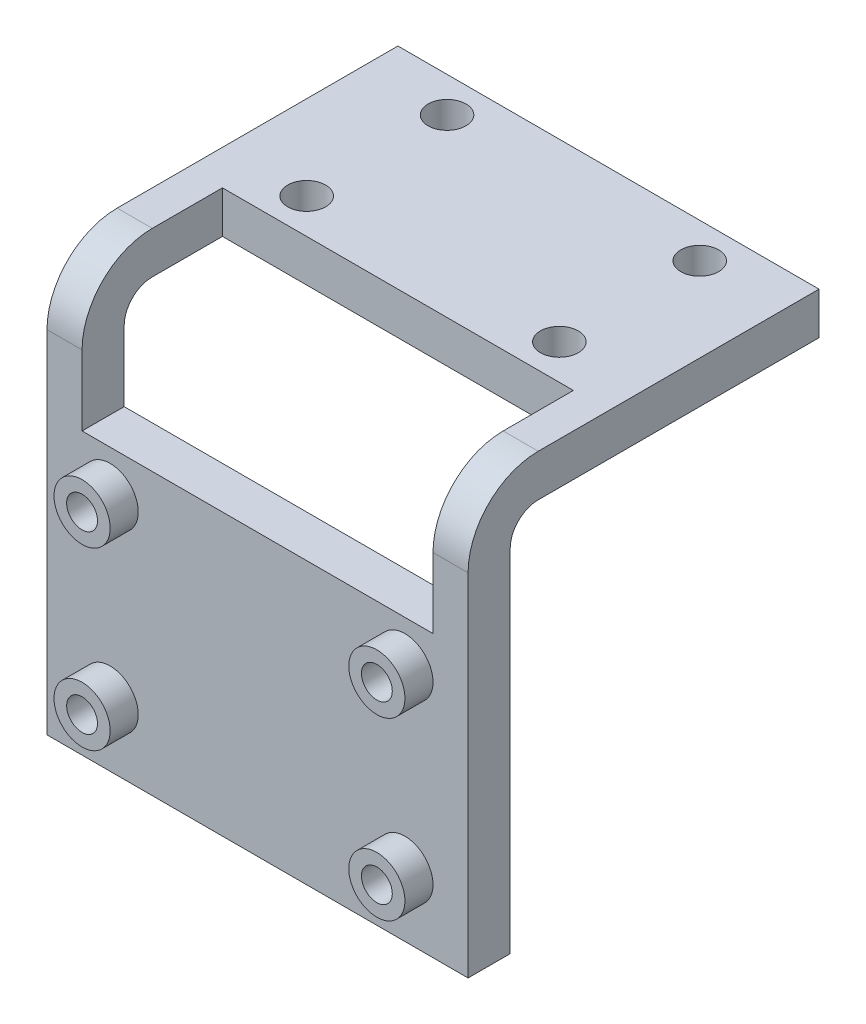
ISO-10303-21;
HEADER;
FILE_DESCRIPTION(('STEP AP214'),'2;1');
FILE_NAME('part.step','',(''),(''),'','','');
FILE_SCHEMA(('AUTOMOTIVE_DESIGN { 1 0 10303 214 1 1 1 1 }'));
ENDSEC;
DATA;
#1=APPLICATION_CONTEXT('core data for automotive mechanical design processes');
#2=APPLICATION_PROTOCOL_DEFINITION('international standard','automotive_design',2000,#1);
#3=PRODUCT_CONTEXT('',#1,'mechanical');
#4=PRODUCT('Part','Part','',(#3));
#5=PRODUCT_RELATED_PRODUCT_CATEGORY('part','',(#4));
#6=PRODUCT_DEFINITION_FORMATION('','',#4);
#7=PRODUCT_DEFINITION_CONTEXT('part definition',#1,'design');
#8=PRODUCT_DEFINITION('design','',#6,#7);
#9=PRODUCT_DEFINITION_SHAPE('','',#8);
#10=(LENGTH_UNIT() NAMED_UNIT(*) SI_UNIT(.MILLI.,.METRE.));
#11=(NAMED_UNIT(*) PLANE_ANGLE_UNIT() SI_UNIT($,.RADIAN.));
#12=(NAMED_UNIT(*) SI_UNIT($,.STERADIAN.) SOLID_ANGLE_UNIT());
#13=UNCERTAINTY_MEASURE_WITH_UNIT(LENGTH_MEASURE(1.E-05),#10,'distance_accuracy_value','');
#14=(GEOMETRIC_REPRESENTATION_CONTEXT(3) GLOBAL_UNCERTAINTY_ASSIGNED_CONTEXT((#13)) GLOBAL_UNIT_ASSIGNED_CONTEXT((#10,
#11,#12)) REPRESENTATION_CONTEXT('',''));
#15=CARTESIAN_POINT('',(0.,0.,0.));
#16=DIRECTION('',(0.,0.,1.));
#17=DIRECTION('',(1.,0.,0.));
#18=AXIS2_PLACEMENT_3D('',#15,#16,#17);
#19=CARTESIAN_POINT('',(0.,0.,0.));
#20=DIRECTION('',(0.,0.,1.));
#21=DIRECTION('',(1.,0.,0.));
#22=AXIS2_PLACEMENT_3D('',#19,#20,#21);
#23=PLANE('',#22);
#24=CARTESIAN_POINT('',(10.5,2.,0.));
#25=DIRECTION('',(0.,0.,1.));
#26=DIRECTION('',(1.,0.,0.));
#27=AXIS2_PLACEMENT_3D('',#24,#25,#26);
#28=CIRCLE('',#27,1.1);
#29=CARTESIAN_POINT('',(11.6,2.,0.));
#30=VERTEX_POINT('',#29);
#31=EDGE_CURVE('E240',#30,#30,#28,.T.);
#32=ORIENTED_EDGE('',*,*,#31,.T.);
#33=EDGE_LOOP('',(#32));
#34=FACE_BOUND('',#33,.T.);
#35=CARTESIAN_POINT('',(-10.5,2.,0.));
#36=DIRECTION('',(0.,0.,1.));
#37=DIRECTION('',(1.,0.,0.));
#38=AXIS2_PLACEMENT_3D('',#35,#36,#37);
#39=CIRCLE('',#38,1.1);
#40=CARTESIAN_POINT('',(-9.4,2.,0.));
#41=VERTEX_POINT('',#40);
#42=EDGE_CURVE('E243',#41,#41,#39,.T.);
#43=ORIENTED_EDGE('',*,*,#42,.T.);
#44=EDGE_LOOP('',(#43));
#45=FACE_BOUND('',#44,.T.);
#46=CARTESIAN_POINT('',(-10.5,-10.5,0.));
#47=DIRECTION('',(0.,0.,1.));
#48=DIRECTION('',(1.,0.,0.));
#49=AXIS2_PLACEMENT_3D('',#46,#47,#48);
#50=CIRCLE('',#49,1.1);
#51=CARTESIAN_POINT('',(-9.4,-10.5,0.));
#52=VERTEX_POINT('',#51);
#53=EDGE_CURVE('E234',#52,#52,#50,.T.);
#54=ORIENTED_EDGE('',*,*,#53,.T.);
#55=EDGE_LOOP('',(#54));
#56=FACE_BOUND('',#55,.T.);
#57=CARTESIAN_POINT('',(10.5,-10.5,0.));
#58=DIRECTION('',(0.,0.,1.));
#59=DIRECTION('',(1.,0.,0.));
#60=AXIS2_PLACEMENT_3D('',#57,#58,#59);
#61=CIRCLE('',#60,1.1);
#62=CARTESIAN_POINT('',(11.6,-10.5,0.));
#63=VERTEX_POINT('',#62);
#64=EDGE_CURVE('E237',#63,#63,#61,.T.);
#65=ORIENTED_EDGE('',*,*,#64,.T.);
#66=EDGE_LOOP('',(#65));
#67=FACE_BOUND('',#66,.T.);
#68=DIRECTION('',(0.,-1.,0.));
#69=VECTOR('',#68,1.);
#70=CARTESIAN_POINT('',(-15.,15.,0.));
#71=LINE('',#70,#69);
#72=CARTESIAN_POINT('',(-15.,10.,0.));
#73=VERTEX_POINT('',#72);
#74=CARTESIAN_POINT('',(-15.,-15.,0.));
#75=VERTEX_POINT('',#74);
#76=EDGE_CURVE('E282',#73,#75,#71,.T.);
#77=ORIENTED_EDGE('',*,*,#76,.F.);
#78=DIRECTION('',(-1.,0.,0.));
#79=VECTOR('',#78,1.);
#80=CARTESIAN_POINT('',(-12.5,10.,0.));
#81=LINE('',#80,#79);
#82=CARTESIAN_POINT('',(-12.5,10.,0.));
#83=VERTEX_POINT('',#82);
#84=EDGE_CURVE('E300',#73,#83,#81,.F.);
#85=ORIENTED_EDGE('',*,*,#84,.T.);
#86=DIRECTION('',(0.,-1.,0.));
#87=VECTOR('',#86,1.);
#88=CARTESIAN_POINT('',(-12.5,12.,0.));
#89=LINE('',#88,#87);
#90=CARTESIAN_POINT('',(-12.5,5.,0.));
#91=VERTEX_POINT('',#90);
#92=EDGE_CURVE('E203',#83,#91,#89,.T.);
#93=ORIENTED_EDGE('',*,*,#92,.T.);
#94=DIRECTION('',(1.,0.,0.));
#95=VECTOR('',#94,1.);
#96=CARTESIAN_POINT('',(-12.5,5.,0.));
#97=LINE('',#96,#95);
#98=CARTESIAN_POINT('',(12.5,5.,0.));
#99=VERTEX_POINT('',#98);
#100=EDGE_CURVE('E205',#91,#99,#97,.T.);
#101=ORIENTED_EDGE('',*,*,#100,.T.);
#102=DIRECTION('',(0.,1.,0.));
#103=VECTOR('',#102,1.);
#104=CARTESIAN_POINT('',(12.5,12.,0.));
#105=LINE('',#104,#103);
#106=CARTESIAN_POINT('',(12.5,10.,0.));
#107=VERTEX_POINT('',#106);
#108=EDGE_CURVE('E209',#99,#107,#105,.T.);
#109=ORIENTED_EDGE('',*,*,#108,.T.);
#110=DIRECTION('',(-1.,0.,0.));
#111=VECTOR('',#110,1.);
#112=CARTESIAN_POINT('',(15.,10.,0.));
#113=LINE('',#112,#111);
#114=CARTESIAN_POINT('',(15.,10.,0.));
#115=VERTEX_POINT('',#114);
#116=EDGE_CURVE('E298',#107,#115,#113,.F.);
#117=ORIENTED_EDGE('',*,*,#116,.T.);
#118=DIRECTION('',(0.,1.,0.));
#119=VECTOR('',#118,1.);
#120=CARTESIAN_POINT('',(15.,15.,0.));
#121=LINE('',#120,#119);
#122=CARTESIAN_POINT('',(15.,-15.,0.));
#123=VERTEX_POINT('',#122);
#124=EDGE_CURVE('E268',#123,#115,#121,.T.);
#125=ORIENTED_EDGE('',*,*,#124,.F.);
#126=DIRECTION('',(1.,0.,0.));
#127=VECTOR('',#126,1.);
#128=CARTESIAN_POINT('',(-15.,-15.,0.));
#129=LINE('',#128,#127);
#130=EDGE_CURVE('E275',#75,#123,#129,.T.);
#131=ORIENTED_EDGE('',*,*,#130,.F.);
#132=EDGE_LOOP('',(#77,#85,#93,#101,#109,#117,#125,#131));
#133=FACE_BOUND('',#132,.T.);
#134=ADVANCED_FACE('F34',(#34,#45,#56,#67,#133),#23,.F.);
#135=CARTESIAN_POINT('',(15.,15.,3.));
#136=DIRECTION('',(-1.,0.,0.));
#137=DIRECTION('',(0.,-1.,0.));
#138=AXIS2_PLACEMENT_3D('',#135,#136,#137);
#139=PLANE('',#138);
#140=DIRECTION('',(0.,0.,-1.));
#141=VECTOR('',#140,1.);
#142=CARTESIAN_POINT('',(15.,15.,3.));
#143=LINE('',#142,#141);
#144=CARTESIAN_POINT('',(15.,15.,-2.));
#145=VERTEX_POINT('',#144);
#146=CARTESIAN_POINT('',(15.,15.,-22.));
#147=VERTEX_POINT('',#146);
#148=EDGE_CURVE('E292',#145,#147,#143,.T.);
#149=ORIENTED_EDGE('',*,*,#148,.F.);
#150=CARTESIAN_POINT('',(15.,10.,-2.));
#151=DIRECTION('',(-1.,0.,0.));
#152=DIRECTION('',(0.,-1.,0.));
#153=AXIS2_PLACEMENT_3D('',#150,#151,#152);
#154=CIRCLE('',#153,5.);
#155=CARTESIAN_POINT('',(15.,10.,3.));
#156=VERTEX_POINT('',#155);
#157=EDGE_CURVE('E11',#145,#156,#154,.F.);
#158=ORIENTED_EDGE('',*,*,#157,.T.);
#159=DIRECTION('',(0.,1.,0.));
#160=VECTOR('',#159,1.);
#161=CARTESIAN_POINT('',(15.,15.,3.));
#162=LINE('',#161,#160);
#163=CARTESIAN_POINT('',(15.,-15.,3.));
#164=VERTEX_POINT('',#163);
#165=EDGE_CURVE('E271',#164,#156,#162,.T.);
#166=ORIENTED_EDGE('',*,*,#165,.F.);
#167=DIRECTION('',(0.,0.,-1.));
#168=VECTOR('',#167,1.);
#169=CARTESIAN_POINT('',(15.,-15.,3.));
#170=LINE('',#169,#168);
#171=EDGE_CURVE('E279',#164,#123,#170,.T.);
#172=ORIENTED_EDGE('',*,*,#171,.T.);
#173=ORIENTED_EDGE('',*,*,#124,.T.);
#174=CARTESIAN_POINT('',(15.,10.,-2.));
#175=DIRECTION('',(-1.,0.,0.));
#176=DIRECTION('',(0.,-1.,0.));
#177=AXIS2_PLACEMENT_3D('',#174,#175,#176);
#178=CIRCLE('',#177,2.);
#179=CARTESIAN_POINT('',(15.,12.,-2.));
#180=VERTEX_POINT('',#179);
#181=EDGE_CURVE('E307',#115,#180,#178,.T.);
#182=ORIENTED_EDGE('',*,*,#181,.T.);
#183=DIRECTION('',(0.,0.,1.));
#184=VECTOR('',#183,1.);
#185=CARTESIAN_POINT('',(15.,12.,-22.));
#186=LINE('',#185,#184);
#187=CARTESIAN_POINT('',(15.,12.,-22.));
#188=VERTEX_POINT('',#187);
#189=EDGE_CURVE('E199',#188,#180,#186,.T.);
#190=ORIENTED_EDGE('',*,*,#189,.F.);
#191=DIRECTION('',(0.,-1.,0.));
#192=VECTOR('',#191,1.);
#193=CARTESIAN_POINT('',(15.,15.,-22.));
#194=LINE('',#193,#192);
#195=EDGE_CURVE('E182',#147,#188,#194,.T.);
#196=ORIENTED_EDGE('',*,*,#195,.F.);
#197=EDGE_LOOP('',(#149,#158,#166,#172,#173,#182,#190,#196));
#198=FACE_BOUND('',#197,.T.);
#199=ADVANCED_FACE('F351',(#198),#139,.F.);
#200=CARTESIAN_POINT('',(-15.,15.,3.));
#201=DIRECTION('',(0.,-1.,0.));
#202=DIRECTION('',(0.,0.,-1.));
#203=AXIS2_PLACEMENT_3D('',#200,#201,#202);
#204=PLANE('',#203);
#205=CARTESIAN_POINT('',(9.,15.,-19.5));
#206=DIRECTION('',(0.,1.,0.));
#207=DIRECTION('',(0.,0.,1.));
#208=AXIS2_PLACEMENT_3D('',#205,#206,#207);
#209=CIRCLE('',#208,1.35);
#210=CARTESIAN_POINT('',(9.,15.,-18.15));
#211=VERTEX_POINT('',#210);
#212=EDGE_CURVE('E697',#211,#211,#209,.T.);
#213=ORIENTED_EDGE('',*,*,#212,.F.);
#214=EDGE_LOOP('',(#213));
#215=FACE_BOUND('',#214,.T.);
#216=CARTESIAN_POINT('',(-9.,15.,-9.5));
#217=DIRECTION('',(0.,1.,0.));
#218=DIRECTION('',(0.,0.,1.));
#219=AXIS2_PLACEMENT_3D('',#216,#217,#218);
#220=CIRCLE('',#219,1.35);
#221=CARTESIAN_POINT('',(-9.,15.,-8.15));
#222=VERTEX_POINT('',#221);
#223=EDGE_CURVE('E694',#222,#222,#220,.T.);
#224=ORIENTED_EDGE('',*,*,#223,.F.);
#225=EDGE_LOOP('',(#224));
#226=FACE_BOUND('',#225,.T.);
#227=CARTESIAN_POINT('',(9.,15.,-9.5));
#228=DIRECTION('',(0.,1.,0.));
#229=DIRECTION('',(0.,0.,1.));
#230=AXIS2_PLACEMENT_3D('',#227,#228,#229);
#231=CIRCLE('',#230,1.35);
#232=CARTESIAN_POINT('',(9.,15.,-8.15));
#233=VERTEX_POINT('',#232);
#234=EDGE_CURVE('E687',#233,#233,#231,.T.);
#235=ORIENTED_EDGE('',*,*,#234,.F.);
#236=EDGE_LOOP('',(#235));
#237=FACE_BOUND('',#236,.T.);
#238=CARTESIAN_POINT('',(-9.,15.,-19.5));
#239=DIRECTION('',(0.,1.,0.));
#240=DIRECTION('',(0.,0.,1.));
#241=AXIS2_PLACEMENT_3D('',#238,#239,#240);
#242=CIRCLE('',#241,1.35);
#243=CARTESIAN_POINT('',(-9.,15.,-18.15));
#244=VERTEX_POINT('',#243);
#245=EDGE_CURVE('E327',#244,#244,#242,.T.);
#246=ORIENTED_EDGE('',*,*,#245,.F.);
#247=EDGE_LOOP('',(#246));
#248=FACE_BOUND('',#247,.T.);
#249=DIRECTION('',(0.,0.,-1.));
#250=VECTOR('',#249,1.);
#251=CARTESIAN_POINT('',(-15.,15.,3.));
#252=LINE('',#251,#250);
#253=CARTESIAN_POINT('',(-15.,15.,-2.));
#254=VERTEX_POINT('',#253);
#255=CARTESIAN_POINT('',(-15.,15.,-22.));
#256=VERTEX_POINT('',#255);
#257=EDGE_CURVE('E290',#254,#256,#252,.T.);
#258=ORIENTED_EDGE('',*,*,#257,.F.);
#259=DIRECTION('',(-1.,0.,0.));
#260=VECTOR('',#259,1.);
#261=CARTESIAN_POINT('',(-12.5,15.,-2.));
#262=LINE('',#261,#260);
#263=CARTESIAN_POINT('',(-12.5,15.,-2.));
#264=VERTEX_POINT('',#263);
#265=EDGE_CURVE('E318',#254,#264,#262,.F.);
#266=ORIENTED_EDGE('',*,*,#265,.T.);
#267=DIRECTION('',(0.,0.,1.));
#268=VECTOR('',#267,1.);
#269=CARTESIAN_POINT('',(-12.5,15.,-7.));
#270=LINE('',#269,#268);
#271=CARTESIAN_POINT('',(-12.5,15.,-7.));
#272=VERTEX_POINT('',#271);
#273=EDGE_CURVE('E180',#272,#264,#270,.T.);
#274=ORIENTED_EDGE('',*,*,#273,.F.);
#275=DIRECTION('',(-1.,0.,0.));
#276=VECTOR('',#275,1.);
#277=CARTESIAN_POINT('',(-12.5,15.,-7.));
#278=LINE('',#277,#276);
#279=CARTESIAN_POINT('',(12.5,15.,-7.));
#280=VERTEX_POINT('',#279);
#281=EDGE_CURVE('E160',#280,#272,#278,.T.);
#282=ORIENTED_EDGE('',*,*,#281,.F.);
#283=DIRECTION('',(0.,0.,1.));
#284=VECTOR('',#283,1.);
#285=CARTESIAN_POINT('',(12.5,15.,-7.));
#286=LINE('',#285,#284);
#287=CARTESIAN_POINT('',(12.5,15.,-2.));
#288=VERTEX_POINT('',#287);
#289=EDGE_CURVE('E183',#280,#288,#286,.T.);
#290=ORIENTED_EDGE('',*,*,#289,.T.);
#291=DIRECTION('',(-1.,0.,0.));
#292=VECTOR('',#291,1.);
#293=CARTESIAN_POINT('',(15.,15.,-2.));
#294=LINE('',#293,#292);
#295=EDGE_CURVE('E51',#288,#145,#294,.F.);
#296=ORIENTED_EDGE('',*,*,#295,.T.);
#297=ORIENTED_EDGE('',*,*,#148,.T.);
#298=DIRECTION('',(1.,0.,0.));
#299=VECTOR('',#298,1.);
#300=CARTESIAN_POINT('',(15.,15.,-22.));
#301=LINE('',#300,#299);
#302=EDGE_CURVE('E193',#256,#147,#301,.T.);
#303=ORIENTED_EDGE('',*,*,#302,.F.);
#304=EDGE_LOOP('',(#258,#266,#274,#282,#290,#296,#297,#303));
#305=FACE_BOUND('',#304,.T.);
#306=ADVANCED_FACE('F357',(#215,#226,#237,#248,#305),#204,.F.);
#307=CARTESIAN_POINT('',(-15.,15.,3.));
#308=DIRECTION('',(1.,0.,0.));
#309=DIRECTION('',(0.,1.,0.));
#310=AXIS2_PLACEMENT_3D('',#307,#308,#309);
#311=PLANE('',#310);
#312=DIRECTION('',(0.,-1.,0.));
#313=VECTOR('',#312,1.);
#314=CARTESIAN_POINT('',(-15.,15.,3.));
#315=LINE('',#314,#313);
#316=CARTESIAN_POINT('',(-15.,10.,3.));
#317=VERTEX_POINT('',#316);
#318=CARTESIAN_POINT('',(-15.,-15.,3.));
#319=VERTEX_POINT('',#318);
#320=EDGE_CURVE('E274',#317,#319,#315,.T.);
#321=ORIENTED_EDGE('',*,*,#320,.F.);
#322=CARTESIAN_POINT('',(-15.,10.,-2.));
#323=DIRECTION('',(1.,0.,0.));
#324=DIRECTION('',(0.,1.,0.));
#325=AXIS2_PLACEMENT_3D('',#322,#323,#324);
#326=CIRCLE('',#325,5.);
#327=EDGE_CURVE('E315',#317,#254,#326,.F.);
#328=ORIENTED_EDGE('',*,*,#327,.T.);
#329=ORIENTED_EDGE('',*,*,#257,.T.);
#330=DIRECTION('',(0.,1.,0.));
#331=VECTOR('',#330,1.);
#332=CARTESIAN_POINT('',(-15.,15.,-22.));
#333=LINE('',#332,#331);
#334=CARTESIAN_POINT('',(-15.,12.,-22.));
#335=VERTEX_POINT('',#334);
#336=EDGE_CURVE('E190',#335,#256,#333,.T.);
#337=ORIENTED_EDGE('',*,*,#336,.F.);
#338=DIRECTION('',(0.,0.,1.));
#339=VECTOR('',#338,1.);
#340=CARTESIAN_POINT('',(-15.,12.,-22.));
#341=LINE('',#340,#339);
#342=CARTESIAN_POINT('',(-15.,12.,-2.));
#343=VERTEX_POINT('',#342);
#344=EDGE_CURVE('E196',#335,#343,#341,.T.);
#345=ORIENTED_EDGE('',*,*,#344,.T.);
#346=CARTESIAN_POINT('',(-15.,10.,-2.));
#347=DIRECTION('',(1.,0.,0.));
#348=DIRECTION('',(0.,1.,0.));
#349=AXIS2_PLACEMENT_3D('',#346,#347,#348);
#350=CIRCLE('',#349,2.);
#351=EDGE_CURVE('E302',#343,#73,#350,.T.);
#352=ORIENTED_EDGE('',*,*,#351,.T.);
#353=ORIENTED_EDGE('',*,*,#76,.T.);
#354=DIRECTION('',(0.,0.,-1.));
#355=VECTOR('',#354,1.);
#356=CARTESIAN_POINT('',(-15.,-15.,3.));
#357=LINE('',#356,#355);
#358=EDGE_CURVE('E287',#319,#75,#357,.T.);
#359=ORIENTED_EDGE('',*,*,#358,.F.);
#360=EDGE_LOOP('',(#321,#328,#329,#337,#345,#352,#353,#359));
#361=FACE_BOUND('',#360,.T.);
#362=ADVANCED_FACE('F368',(#361),#311,.F.);
#363=CARTESIAN_POINT('',(-15.,-15.,3.));
#364=DIRECTION('',(0.,1.,0.));
#365=DIRECTION('',(0.,0.,1.));
#366=AXIS2_PLACEMENT_3D('',#363,#364,#365);
#367=PLANE('',#366);
#368=ORIENTED_EDGE('',*,*,#130,.T.);
#369=ORIENTED_EDGE('',*,*,#171,.F.);
#370=DIRECTION('',(1.,0.,0.));
#371=VECTOR('',#370,1.);
#372=CARTESIAN_POINT('',(-15.,-15.,3.));
#373=LINE('',#372,#371);
#374=EDGE_CURVE('E277',#319,#164,#373,.T.);
#375=ORIENTED_EDGE('',*,*,#374,.F.);
#376=ORIENTED_EDGE('',*,*,#358,.T.);
#377=EDGE_LOOP('',(#368,#369,#375,#376));
#378=FACE_BOUND('',#377,.T.);
#379=ADVANCED_FACE('F365',(#378),#367,.F.);
#380=CARTESIAN_POINT('',(0.,0.,3.));
#381=DIRECTION('',(0.,0.,1.));
#382=DIRECTION('',(1.,0.,0.));
#383=AXIS2_PLACEMENT_3D('',#380,#381,#382);
#384=PLANE('',#383);
#385=DIRECTION('',(0.,-1.,0.));
#386=VECTOR('',#385,1.);
#387=CARTESIAN_POINT('',(-12.5,12.,3.));
#388=LINE('',#387,#386);
#389=CARTESIAN_POINT('',(-12.5,10.,3.));
#390=VERTEX_POINT('',#389);
#391=CARTESIAN_POINT('',(-12.5,5.,3.));
#392=VERTEX_POINT('',#391);
#393=EDGE_CURVE('E202',#390,#392,#388,.T.);
#394=ORIENTED_EDGE('',*,*,#393,.F.);
#395=DIRECTION('',(-1.,0.,0.));
#396=VECTOR('',#395,1.);
#397=CARTESIAN_POINT('',(-15.,10.,3.));
#398=LINE('',#397,#396);
#399=EDGE_CURVE('E312',#390,#317,#398,.T.);
#400=ORIENTED_EDGE('',*,*,#399,.T.);
#401=ORIENTED_EDGE('',*,*,#320,.T.);
#402=ORIENTED_EDGE('',*,*,#374,.T.);
#403=ORIENTED_EDGE('',*,*,#165,.T.);
#404=DIRECTION('',(-1.,0.,0.));
#405=VECTOR('',#404,1.);
#406=CARTESIAN_POINT('',(12.5,10.,3.));
#407=LINE('',#406,#405);
#408=CARTESIAN_POINT('',(12.5,10.,3.));
#409=VERTEX_POINT('',#408);
#410=EDGE_CURVE('E309',#156,#409,#407,.T.);
#411=ORIENTED_EDGE('',*,*,#410,.T.);
#412=DIRECTION('',(0.,1.,0.));
#413=VECTOR('',#412,1.);
#414=CARTESIAN_POINT('',(12.5,12.,3.));
#415=LINE('',#414,#413);
#416=CARTESIAN_POINT('',(12.5,5.,3.));
#417=VERTEX_POINT('',#416);
#418=EDGE_CURVE('E206',#417,#409,#415,.T.);
#419=ORIENTED_EDGE('',*,*,#418,.F.);
#420=DIRECTION('',(1.,0.,0.));
#421=VECTOR('',#420,1.);
#422=CARTESIAN_POINT('',(-12.5,5.,3.));
#423=LINE('',#422,#421);
#424=EDGE_CURVE('E214',#392,#417,#423,.T.);
#425=ORIENTED_EDGE('',*,*,#424,.F.);
#426=EDGE_LOOP('',(#394,#400,#401,#402,#403,#411,#419,#425));
#427=FACE_BOUND('',#426,.T.);
#428=CARTESIAN_POINT('',(-10.5,-10.5,3.));
#429=DIRECTION('',(0.,0.,1.));
#430=DIRECTION('',(1.,0.,0.));
#431=AXIS2_PLACEMENT_3D('',#428,#429,#430);
#432=CIRCLE('',#431,2.);
#433=CARTESIAN_POINT('',(-8.5,-10.5,3.));
#434=VERTEX_POINT('',#433);
#435=EDGE_CURVE('E246',#434,#434,#432,.T.);
#436=ORIENTED_EDGE('',*,*,#435,.F.);
#437=EDGE_LOOP('',(#436));
#438=FACE_BOUND('',#437,.T.);
#439=CARTESIAN_POINT('',(10.5,-10.5,3.));
#440=DIRECTION('',(0.,0.,1.));
#441=DIRECTION('',(1.,0.,0.));
#442=AXIS2_PLACEMENT_3D('',#439,#440,#441);
#443=CIRCLE('',#442,2.);
#444=CARTESIAN_POINT('',(12.5,-10.5,3.));
#445=VERTEX_POINT('',#444);
#446=EDGE_CURVE('E250',#445,#445,#443,.T.);
#447=ORIENTED_EDGE('',*,*,#446,.F.);
#448=EDGE_LOOP('',(#447));
#449=FACE_BOUND('',#448,.T.);
#450=CARTESIAN_POINT('',(10.5,2.,3.));
#451=DIRECTION('',(0.,0.,1.));
#452=DIRECTION('',(1.,0.,0.));
#453=AXIS2_PLACEMENT_3D('',#450,#451,#452);
#454=CIRCLE('',#453,2.);
#455=CARTESIAN_POINT('',(12.5,2.,3.));
#456=VERTEX_POINT('',#455);
#457=EDGE_CURVE('E256',#456,#456,#454,.T.);
#458=ORIENTED_EDGE('',*,*,#457,.F.);
#459=EDGE_LOOP('',(#458));
#460=FACE_BOUND('',#459,.T.);
#461=CARTESIAN_POINT('',(-10.5,2.,3.));
#462=DIRECTION('',(0.,0.,1.));
#463=DIRECTION('',(1.,0.,0.));
#464=AXIS2_PLACEMENT_3D('',#461,#462,#463);
#465=CIRCLE('',#464,2.);
#466=CARTESIAN_POINT('',(-8.5,2.,3.));
#467=VERTEX_POINT('',#466);
#468=EDGE_CURVE('E262',#467,#467,#465,.T.);
#469=ORIENTED_EDGE('',*,*,#468,.F.);
#470=EDGE_LOOP('',(#469));
#471=FACE_BOUND('',#470,.T.);
#472=ADVANCED_FACE('F363',(#427,#438,#449,#460,#471),#384,.T.);
#473=CARTESIAN_POINT('',(-10.5,2.,5.));
#474=DIRECTION('',(0.,0.,-1.));
#475=DIRECTION('',(-1.,0.,0.));
#476=AXIS2_PLACEMENT_3D('',#473,#474,#475);
#477=CYLINDRICAL_SURFACE('',#476,2.);
#478=CARTESIAN_POINT('',(-10.5,2.,5.));
#479=DIRECTION('',(0.,0.,1.));
#480=DIRECTION('',(1.,0.,0.));
#481=AXIS2_PLACEMENT_3D('',#478,#479,#480);
#482=CIRCLE('',#481,2.);
#483=CARTESIAN_POINT('',(-8.5,2.,5.));
#484=VERTEX_POINT('',#483);
#485=EDGE_CURVE('E265',#484,#484,#482,.T.);
#486=ORIENTED_EDGE('',*,*,#485,.F.);
#487=EDGE_LOOP('',(#486));
#488=FACE_BOUND('',#487,.T.);
#489=ORIENTED_EDGE('',*,*,#468,.T.);
#490=EDGE_LOOP('',(#489));
#491=FACE_BOUND('',#490,.T.);
#492=ADVANCED_FACE('F482',(#488,#491),#477,.T.);
#493=CARTESIAN_POINT('',(-10.5,2.,5.));
#494=DIRECTION('',(0.,0.,1.));
#495=DIRECTION('',(1.,0.,0.));
#496=AXIS2_PLACEMENT_3D('',#493,#494,#495);
#497=PLANE('',#496);
#498=CARTESIAN_POINT('',(-10.5,2.,5.));
#499=DIRECTION('',(0.,0.,1.));
#500=DIRECTION('',(1.,0.,0.));
#501=AXIS2_PLACEMENT_3D('',#498,#499,#500);
#502=CIRCLE('',#501,1.1);
#503=CARTESIAN_POINT('',(-9.4,2.,5.));
#504=VERTEX_POINT('',#503);
#505=EDGE_CURVE('E223',#504,#504,#502,.T.);
#506=ORIENTED_EDGE('',*,*,#505,.F.);
#507=EDGE_LOOP('',(#506));
#508=FACE_BOUND('',#507,.T.);
#509=ORIENTED_EDGE('',*,*,#485,.T.);
#510=EDGE_LOOP('',(#509));
#511=FACE_BOUND('',#510,.T.);
#512=ADVANCED_FACE('F479',(#508,#511),#497,.T.);
#513=CARTESIAN_POINT('',(10.5,2.,5.));
#514=DIRECTION('',(0.,0.,-1.));
#515=DIRECTION('',(-1.,0.,0.));
#516=AXIS2_PLACEMENT_3D('',#513,#514,#515);
#517=CYLINDRICAL_SURFACE('',#516,2.);
#518=CARTESIAN_POINT('',(10.5,2.,5.));
#519=DIRECTION('',(0.,0.,1.));
#520=DIRECTION('',(1.,0.,0.));
#521=AXIS2_PLACEMENT_3D('',#518,#519,#520);
#522=CIRCLE('',#521,2.);
#523=CARTESIAN_POINT('',(12.5,2.,5.));
#524=VERTEX_POINT('',#523);
#525=EDGE_CURVE('E259',#524,#524,#522,.T.);
#526=ORIENTED_EDGE('',*,*,#525,.F.);
#527=EDGE_LOOP('',(#526));
#528=FACE_BOUND('',#527,.T.);
#529=ORIENTED_EDGE('',*,*,#457,.T.);
#530=EDGE_LOOP('',(#529));
#531=FACE_BOUND('',#530,.T.);
#532=ADVANCED_FACE('F475',(#528,#531),#517,.T.);
#533=CARTESIAN_POINT('',(10.5,2.,5.));
#534=DIRECTION('',(0.,0.,1.));
#535=DIRECTION('',(1.,0.,0.));
#536=AXIS2_PLACEMENT_3D('',#533,#534,#535);
#537=PLANE('',#536);
#538=CARTESIAN_POINT('',(10.5,2.,5.));
#539=DIRECTION('',(0.,0.,1.));
#540=DIRECTION('',(1.,0.,0.));
#541=AXIS2_PLACEMENT_3D('',#538,#539,#540);
#542=CIRCLE('',#541,1.1);
#543=CARTESIAN_POINT('',(11.6,2.,5.));
#544=VERTEX_POINT('',#543);
#545=EDGE_CURVE('E226',#544,#544,#542,.T.);
#546=ORIENTED_EDGE('',*,*,#545,.F.);
#547=EDGE_LOOP('',(#546));
#548=FACE_BOUND('',#547,.T.);
#549=ORIENTED_EDGE('',*,*,#525,.T.);
#550=EDGE_LOOP('',(#549));
#551=FACE_BOUND('',#550,.T.);
#552=ADVANCED_FACE('F471',(#548,#551),#537,.T.);
#553=CARTESIAN_POINT('',(10.5,-10.5,5.));
#554=DIRECTION('',(0.,0.,-1.));
#555=DIRECTION('',(-1.,0.,0.));
#556=AXIS2_PLACEMENT_3D('',#553,#554,#555);
#557=CYLINDRICAL_SURFACE('',#556,2.);
#558=CARTESIAN_POINT('',(10.5,-10.5,5.));
#559=DIRECTION('',(0.,0.,1.));
#560=DIRECTION('',(1.,0.,0.));
#561=AXIS2_PLACEMENT_3D('',#558,#559,#560);
#562=CIRCLE('',#561,2.);
#563=CARTESIAN_POINT('',(12.5,-10.5,5.));
#564=VERTEX_POINT('',#563);
#565=EDGE_CURVE('E253',#564,#564,#562,.T.);
#566=ORIENTED_EDGE('',*,*,#565,.F.);
#567=EDGE_LOOP('',(#566));
#568=FACE_BOUND('',#567,.T.);
#569=ORIENTED_EDGE('',*,*,#446,.T.);
#570=EDGE_LOOP('',(#569));
#571=FACE_BOUND('',#570,.T.);
#572=ADVANCED_FACE('F467',(#568,#571),#557,.T.);
#573=CARTESIAN_POINT('',(10.5,-10.5,5.));
#574=DIRECTION('',(0.,0.,1.));
#575=DIRECTION('',(1.,0.,0.));
#576=AXIS2_PLACEMENT_3D('',#573,#574,#575);
#577=PLANE('',#576);
#578=CARTESIAN_POINT('',(10.5,-10.5,5.));
#579=DIRECTION('',(0.,0.,1.));
#580=DIRECTION('',(1.,0.,0.));
#581=AXIS2_PLACEMENT_3D('',#578,#579,#580);
#582=CIRCLE('',#581,1.1);
#583=CARTESIAN_POINT('',(11.6,-10.5,5.));
#584=VERTEX_POINT('',#583);
#585=EDGE_CURVE('E220',#584,#584,#582,.T.);
#586=ORIENTED_EDGE('',*,*,#585,.F.);
#587=EDGE_LOOP('',(#586));
#588=FACE_BOUND('',#587,.T.);
#589=ORIENTED_EDGE('',*,*,#565,.T.);
#590=EDGE_LOOP('',(#589));
#591=FACE_BOUND('',#590,.T.);
#592=ADVANCED_FACE('F463',(#588,#591),#577,.T.);
#593=CARTESIAN_POINT('',(-10.5,-10.5,5.));
#594=DIRECTION('',(0.,0.,-1.));
#595=DIRECTION('',(-1.,0.,0.));
#596=AXIS2_PLACEMENT_3D('',#593,#594,#595);
#597=CYLINDRICAL_SURFACE('',#596,2.);
#598=CARTESIAN_POINT('',(-10.5,-10.5,5.));
#599=DIRECTION('',(0.,0.,1.));
#600=DIRECTION('',(1.,0.,0.));
#601=AXIS2_PLACEMENT_3D('',#598,#599,#600);
#602=CIRCLE('',#601,2.);
#603=CARTESIAN_POINT('',(-8.5,-10.5,5.));
#604=VERTEX_POINT('',#603);
#605=EDGE_CURVE('E247',#604,#604,#602,.T.);
#606=ORIENTED_EDGE('',*,*,#605,.F.);
#607=EDGE_LOOP('',(#606));
#608=FACE_BOUND('',#607,.T.);
#609=ORIENTED_EDGE('',*,*,#435,.T.);
#610=EDGE_LOOP('',(#609));
#611=FACE_BOUND('',#610,.T.);
#612=ADVANCED_FACE('F459',(#608,#611),#597,.T.);
#613=CARTESIAN_POINT('',(-10.5,-10.5,5.));
#614=DIRECTION('',(0.,0.,1.));
#615=DIRECTION('',(1.,0.,0.));
#616=AXIS2_PLACEMENT_3D('',#613,#614,#615);
#617=PLANE('',#616);
#618=CARTESIAN_POINT('',(-10.5,-10.5,5.));
#619=DIRECTION('',(0.,0.,1.));
#620=DIRECTION('',(1.,0.,0.));
#621=AXIS2_PLACEMENT_3D('',#618,#619,#620);
#622=CIRCLE('',#621,1.1);
#623=CARTESIAN_POINT('',(-9.4,-10.5,5.));
#624=VERTEX_POINT('',#623);
#625=EDGE_CURVE('E227',#624,#624,#622,.T.);
#626=ORIENTED_EDGE('',*,*,#625,.F.);
#627=EDGE_LOOP('',(#626));
#628=FACE_BOUND('',#627,.T.);
#629=ORIENTED_EDGE('',*,*,#605,.T.);
#630=EDGE_LOOP('',(#629));
#631=FACE_BOUND('',#630,.T.);
#632=ADVANCED_FACE('F449',(#628,#631),#617,.T.);
#633=CARTESIAN_POINT('',(-10.5,-10.5,-7.));
#634=DIRECTION('',(0.,0.,1.));
#635=DIRECTION('',(1.,0.,0.));
#636=AXIS2_PLACEMENT_3D('',#633,#634,#635);
#637=CYLINDRICAL_SURFACE('',#636,1.1);
#638=ORIENTED_EDGE('',*,*,#625,.T.);
#639=EDGE_LOOP('',(#638));
#640=FACE_BOUND('',#639,.T.);
#641=ORIENTED_EDGE('',*,*,#53,.F.);
#642=EDGE_LOOP('',(#641));
#643=FACE_BOUND('',#642,.T.);
#644=ADVANCED_FACE('F445',(#640,#643),#637,.F.);
#645=CARTESIAN_POINT('',(10.5,-10.5,-7.));
#646=DIRECTION('',(0.,0.,1.));
#647=DIRECTION('',(1.,0.,0.));
#648=AXIS2_PLACEMENT_3D('',#645,#646,#647);
#649=CYLINDRICAL_SURFACE('',#648,1.1);
#650=ORIENTED_EDGE('',*,*,#585,.T.);
#651=EDGE_LOOP('',(#650));
#652=FACE_BOUND('',#651,.T.);
#653=ORIENTED_EDGE('',*,*,#64,.F.);
#654=EDGE_LOOP('',(#653));
#655=FACE_BOUND('',#654,.T.);
#656=ADVANCED_FACE('F448',(#652,#655),#649,.F.);
#657=CARTESIAN_POINT('',(10.5,2.,-7.));
#658=DIRECTION('',(0.,0.,1.));
#659=DIRECTION('',(1.,0.,0.));
#660=AXIS2_PLACEMENT_3D('',#657,#658,#659);
#661=CYLINDRICAL_SURFACE('',#660,1.1);
#662=ORIENTED_EDGE('',*,*,#545,.T.);
#663=EDGE_LOOP('',(#662));
#664=FACE_BOUND('',#663,.T.);
#665=ORIENTED_EDGE('',*,*,#31,.F.);
#666=EDGE_LOOP('',(#665));
#667=FACE_BOUND('',#666,.T.);
#668=ADVANCED_FACE('F443',(#664,#667),#661,.F.);
#669=CARTESIAN_POINT('',(-10.5,2.,-7.));
#670=DIRECTION('',(0.,0.,1.));
#671=DIRECTION('',(1.,0.,0.));
#672=AXIS2_PLACEMENT_3D('',#669,#670,#671);
#673=CYLINDRICAL_SURFACE('',#672,1.1);
#674=ORIENTED_EDGE('',*,*,#505,.T.);
#675=EDGE_LOOP('',(#674));
#676=FACE_BOUND('',#675,.T.);
#677=ORIENTED_EDGE('',*,*,#42,.F.);
#678=EDGE_LOOP('',(#677));
#679=FACE_BOUND('',#678,.T.);
#680=ADVANCED_FACE('F440',(#676,#679),#673,.F.);
#681=CARTESIAN_POINT('',(-12.5,12.,0.));
#682=DIRECTION('',(-1.,0.,0.));
#683=DIRECTION('',(0.,0.,1.));
#684=AXIS2_PLACEMENT_3D('',#681,#682,#683);
#685=PLANE('',#684);
#686=ORIENTED_EDGE('',*,*,#273,.T.);
#687=CARTESIAN_POINT('',(-12.5,10.,-2.));
#688=DIRECTION('',(-1.,0.,0.));
#689=DIRECTION('',(0.,0.,1.));
#690=AXIS2_PLACEMENT_3D('',#687,#688,#689);
#691=CIRCLE('',#690,5.);
#692=EDGE_CURVE('E320',#264,#390,#691,.F.);
#693=ORIENTED_EDGE('',*,*,#692,.T.);
#694=ORIENTED_EDGE('',*,*,#393,.T.);
#695=DIRECTION('',(0.,0.,1.));
#696=VECTOR('',#695,1.);
#697=CARTESIAN_POINT('',(-12.5,5.,0.));
#698=LINE('',#697,#696);
#699=EDGE_CURVE('E212',#91,#392,#698,.T.);
#700=ORIENTED_EDGE('',*,*,#699,.F.);
#701=ORIENTED_EDGE('',*,*,#92,.F.);
#702=CARTESIAN_POINT('',(-12.5,10.,-2.));
#703=DIRECTION('',(-1.,0.,0.));
#704=DIRECTION('',(0.,0.,1.));
#705=AXIS2_PLACEMENT_3D('',#702,#703,#704);
#706=CIRCLE('',#705,2.);
#707=CARTESIAN_POINT('',(-12.5,12.,-2.));
#708=VERTEX_POINT('',#707);
#709=EDGE_CURVE('E154',#83,#708,#706,.T.);
#710=ORIENTED_EDGE('',*,*,#709,.T.);
#711=DIRECTION('',(0.,0.,1.));
#712=VECTOR('',#711,1.);
#713=CARTESIAN_POINT('',(-12.5,12.,-7.));
#714=LINE('',#713,#712);
#715=CARTESIAN_POINT('',(-12.5,12.,-7.));
#716=VERTEX_POINT('',#715);
#717=EDGE_CURVE('E146',#716,#708,#714,.T.);
#718=ORIENTED_EDGE('',*,*,#717,.F.);
#719=DIRECTION('',(0.,-1.,0.));
#720=VECTOR('',#719,1.);
#721=CARTESIAN_POINT('',(-12.5,12.,-7.));
#722=LINE('',#721,#720);
#723=EDGE_CURVE('E150',#272,#716,#722,.T.);
#724=ORIENTED_EDGE('',*,*,#723,.F.);
#725=EDGE_LOOP('',(#686,#693,#694,#700,#701,#710,#718,#724));
#726=FACE_BOUND('',#725,.T.);
#727=ADVANCED_FACE('F149',(#726),#685,.F.);
#728=CARTESIAN_POINT('',(-12.5,12.,0.));
#729=DIRECTION('',(0.,1.,0.));
#730=DIRECTION('',(0.,0.,1.));
#731=AXIS2_PLACEMENT_3D('',#728,#729,#730);
#732=PLANE('',#731);
#733=CARTESIAN_POINT('',(9.,12.,-19.5));
#734=DIRECTION('',(0.,1.,0.));
#735=DIRECTION('',(0.,0.,1.));
#736=AXIS2_PLACEMENT_3D('',#733,#734,#735);
#737=CIRCLE('',#736,1.35);
#738=CARTESIAN_POINT('',(9.,12.,-18.15));
#739=VERTEX_POINT('',#738);
#740=EDGE_CURVE('E38',#739,#739,#737,.T.);
#741=ORIENTED_EDGE('',*,*,#740,.T.);
#742=EDGE_LOOP('',(#741));
#743=FACE_BOUND('',#742,.T.);
#744=CARTESIAN_POINT('',(-9.,12.,-9.5));
#745=DIRECTION('',(0.,1.,0.));
#746=DIRECTION('',(0.,0.,1.));
#747=AXIS2_PLACEMENT_3D('',#744,#745,#746);
#748=CIRCLE('',#747,1.35);
#749=CARTESIAN_POINT('',(-9.,12.,-8.15));
#750=VERTEX_POINT('',#749);
#751=EDGE_CURVE('E329',#750,#750,#748,.T.);
#752=ORIENTED_EDGE('',*,*,#751,.T.);
#753=EDGE_LOOP('',(#752));
#754=FACE_BOUND('',#753,.T.);
#755=CARTESIAN_POINT('',(9.,12.,-9.5));
#756=DIRECTION('',(0.,1.,0.));
#757=DIRECTION('',(0.,0.,1.));
#758=AXIS2_PLACEMENT_3D('',#755,#756,#757);
#759=CIRCLE('',#758,1.35);
#760=CARTESIAN_POINT('',(9.,12.,-8.15));
#761=VERTEX_POINT('',#760);
#762=EDGE_CURVE('E326',#761,#761,#759,.T.);
#763=ORIENTED_EDGE('',*,*,#762,.T.);
#764=EDGE_LOOP('',(#763));
#765=FACE_BOUND('',#764,.T.);
#766=CARTESIAN_POINT('',(-9.,12.,-19.5));
#767=DIRECTION('',(0.,1.,0.));
#768=DIRECTION('',(0.,0.,1.));
#769=AXIS2_PLACEMENT_3D('',#766,#767,#768);
#770=CIRCLE('',#769,1.35);
#771=CARTESIAN_POINT('',(-9.,12.,-18.15));
#772=VERTEX_POINT('',#771);
#773=EDGE_CURVE('E323',#772,#772,#770,.T.);
#774=ORIENTED_EDGE('',*,*,#773,.T.);
#775=EDGE_LOOP('',(#774));
#776=FACE_BOUND('',#775,.T.);
#777=ORIENTED_EDGE('',*,*,#717,.T.);
#778=DIRECTION('',(-1.,0.,0.));
#779=VECTOR('',#778,1.);
#780=CARTESIAN_POINT('',(-15.,12.,-2.));
#781=LINE('',#780,#779);
#782=EDGE_CURVE('E296',#708,#343,#781,.T.);
#783=ORIENTED_EDGE('',*,*,#782,.T.);
#784=ORIENTED_EDGE('',*,*,#344,.F.);
#785=DIRECTION('',(-1.,0.,0.));
#786=VECTOR('',#785,1.);
#787=CARTESIAN_POINT('',(15.,12.,-22.));
#788=LINE('',#787,#786);
#789=EDGE_CURVE('E188',#188,#335,#788,.T.);
#790=ORIENTED_EDGE('',*,*,#789,.F.);
#791=ORIENTED_EDGE('',*,*,#189,.T.);
#792=DIRECTION('',(-1.,0.,0.));
#793=VECTOR('',#792,1.);
#794=CARTESIAN_POINT('',(12.5,12.,-2.));
#795=LINE('',#794,#793);
#796=CARTESIAN_POINT('',(12.5,12.,-2.));
#797=VERTEX_POINT('',#796);
#798=EDGE_CURVE('E294',#180,#797,#795,.T.);
#799=ORIENTED_EDGE('',*,*,#798,.T.);
#800=DIRECTION('',(0.,0.,1.));
#801=VECTOR('',#800,1.);
#802=CARTESIAN_POINT('',(12.5,12.,-7.));
#803=LINE('',#802,#801);
#804=CARTESIAN_POINT('',(12.5,12.,-7.));
#805=VERTEX_POINT('',#804);
#806=EDGE_CURVE('E159',#805,#797,#803,.T.);
#807=ORIENTED_EDGE('',*,*,#806,.F.);
#808=DIRECTION('',(1.,0.,0.));
#809=VECTOR('',#808,1.);
#810=CARTESIAN_POINT('',(-12.5,12.,-7.));
#811=LINE('',#810,#809);
#812=EDGE_CURVE('E166',#716,#805,#811,.T.);
#813=ORIENTED_EDGE('',*,*,#812,.F.);
#814=EDGE_LOOP('',(#777,#783,#784,#790,#791,#799,#807,#813));
#815=FACE_BOUND('',#814,.T.);
#816=ADVANCED_FACE('F171',(#743,#754,#765,#776,#815),#732,.F.);
#817=CARTESIAN_POINT('',(12.5,12.,0.));
#818=DIRECTION('',(1.,0.,0.));
#819=DIRECTION('',(0.,1.,0.));
#820=AXIS2_PLACEMENT_3D('',#817,#818,#819);
#821=PLANE('',#820);
#822=ORIENTED_EDGE('',*,*,#418,.T.);
#823=CARTESIAN_POINT('',(12.5,10.,-2.));
#824=DIRECTION('',(1.,0.,0.));
#825=DIRECTION('',(0.,1.,0.));
#826=AXIS2_PLACEMENT_3D('',#823,#824,#825);
#827=CIRCLE('',#826,5.);
#828=EDGE_CURVE('E43',#409,#288,#827,.F.);
#829=ORIENTED_EDGE('',*,*,#828,.T.);
#830=ORIENTED_EDGE('',*,*,#289,.F.);
#831=DIRECTION('',(0.,1.,0.));
#832=VECTOR('',#831,1.);
#833=CARTESIAN_POINT('',(12.5,12.,-7.));
#834=LINE('',#833,#832);
#835=EDGE_CURVE('E174',#805,#280,#834,.T.);
#836=ORIENTED_EDGE('',*,*,#835,.F.);
#837=ORIENTED_EDGE('',*,*,#806,.T.);
#838=CARTESIAN_POINT('',(12.5,10.,-2.));
#839=DIRECTION('',(1.,0.,0.));
#840=DIRECTION('',(0.,1.,0.));
#841=AXIS2_PLACEMENT_3D('',#838,#839,#840);
#842=CIRCLE('',#841,2.);
#843=EDGE_CURVE('E305',#797,#107,#842,.T.);
#844=ORIENTED_EDGE('',*,*,#843,.T.);
#845=ORIENTED_EDGE('',*,*,#108,.F.);
#846=DIRECTION('',(0.,0.,1.));
#847=VECTOR('',#846,1.);
#848=CARTESIAN_POINT('',(12.5,5.,0.));
#849=LINE('',#848,#847);
#850=EDGE_CURVE('E218',#99,#417,#849,.T.);
#851=ORIENTED_EDGE('',*,*,#850,.T.);
#852=EDGE_LOOP('',(#822,#829,#830,#836,#837,#844,#845,#851));
#853=FACE_BOUND('',#852,.T.);
#854=ADVANCED_FACE('F419',(#853),#821,.F.);
#855=CARTESIAN_POINT('',(-12.5,5.,0.));
#856=DIRECTION('',(0.,-1.,0.));
#857=DIRECTION('',(0.,0.,-1.));
#858=AXIS2_PLACEMENT_3D('',#855,#856,#857);
#859=PLANE('',#858);
#860=ORIENTED_EDGE('',*,*,#424,.T.);
#861=ORIENTED_EDGE('',*,*,#850,.F.);
#862=ORIENTED_EDGE('',*,*,#100,.F.);
#863=ORIENTED_EDGE('',*,*,#699,.T.);
#864=EDGE_LOOP('',(#860,#861,#862,#863));
#865=FACE_BOUND('',#864,.T.);
#866=ADVANCED_FACE('F403',(#865),#859,.F.);
#867=CARTESIAN_POINT('',(0.,0.,-22.));
#868=DIRECTION('',(0.,0.,-1.));
#869=DIRECTION('',(-1.,0.,0.));
#870=AXIS2_PLACEMENT_3D('',#867,#868,#869);
#871=PLANE('',#870);
#872=ORIENTED_EDGE('',*,*,#195,.T.);
#873=ORIENTED_EDGE('',*,*,#789,.T.);
#874=ORIENTED_EDGE('',*,*,#336,.T.);
#875=ORIENTED_EDGE('',*,*,#302,.T.);
#876=EDGE_LOOP('',(#872,#873,#874,#875));
#877=FACE_BOUND('',#876,.T.);
#878=ADVANCED_FACE('F413',(#877),#871,.T.);
#879=CARTESIAN_POINT('',(0.,0.,-7.));
#880=DIRECTION('',(0.,0.,-1.));
#881=DIRECTION('',(-1.,0.,0.));
#882=AXIS2_PLACEMENT_3D('',#879,#880,#881);
#883=PLANE('',#882);
#884=ORIENTED_EDGE('',*,*,#723,.T.);
#885=ORIENTED_EDGE('',*,*,#812,.T.);
#886=ORIENTED_EDGE('',*,*,#835,.T.);
#887=ORIENTED_EDGE('',*,*,#281,.T.);
#888=EDGE_LOOP('',(#884,#885,#886,#887));
#889=FACE_BOUND('',#888,.T.);
#890=ADVANCED_FACE('F164',(#889),#883,.F.);
#891=CARTESIAN_POINT('',(-12.5,10.,-2.));
#892=DIRECTION('',(1.,0.,0.));
#893=DIRECTION('',(0.,0.,-1.));
#894=AXIS2_PLACEMENT_3D('',#891,#892,#893);
#895=CYLINDRICAL_SURFACE('',#894,2.);
#896=ORIENTED_EDGE('',*,*,#709,.F.);
#897=ORIENTED_EDGE('',*,*,#84,.F.);
#898=ORIENTED_EDGE('',*,*,#351,.F.);
#899=ORIENTED_EDGE('',*,*,#782,.F.);
#900=EDGE_LOOP('',(#896,#897,#898,#899));
#901=FACE_BOUND('',#900,.T.);
#902=ADVANCED_FACE('F376',(#901),#895,.F.);
#903=CARTESIAN_POINT('',(-12.5,10.,-2.));
#904=DIRECTION('',(1.,0.,0.));
#905=DIRECTION('',(0.,0.,-1.));
#906=AXIS2_PLACEMENT_3D('',#903,#904,#905);
#907=CYLINDRICAL_SURFACE('',#906,2.);
#908=ORIENTED_EDGE('',*,*,#181,.F.);
#909=ORIENTED_EDGE('',*,*,#116,.F.);
#910=ORIENTED_EDGE('',*,*,#843,.F.);
#911=ORIENTED_EDGE('',*,*,#798,.F.);
#912=EDGE_LOOP('',(#908,#909,#910,#911));
#913=FACE_BOUND('',#912,.T.);
#914=ADVANCED_FACE('F379',(#913),#907,.F.);
#915=CARTESIAN_POINT('',(0.,10.,-2.));
#916=DIRECTION('',(1.,0.,0.));
#917=DIRECTION('',(0.,0.,-1.));
#918=AXIS2_PLACEMENT_3D('',#915,#916,#917);
#919=CYLINDRICAL_SURFACE('',#918,5.);
#920=ORIENTED_EDGE('',*,*,#692,.F.);
#921=ORIENTED_EDGE('',*,*,#265,.F.);
#922=ORIENTED_EDGE('',*,*,#327,.F.);
#923=ORIENTED_EDGE('',*,*,#399,.F.);
#924=EDGE_LOOP('',(#920,#921,#922,#923));
#925=FACE_BOUND('',#924,.T.);
#926=ADVANCED_FACE('F382',(#925),#919,.T.);
#927=CARTESIAN_POINT('',(0.,10.,-2.));
#928=DIRECTION('',(1.,0.,0.));
#929=DIRECTION('',(0.,0.,-1.));
#930=AXIS2_PLACEMENT_3D('',#927,#928,#929);
#931=CYLINDRICAL_SURFACE('',#930,5.);
#932=ORIENTED_EDGE('',*,*,#157,.F.);
#933=ORIENTED_EDGE('',*,*,#295,.F.);
#934=ORIENTED_EDGE('',*,*,#828,.F.);
#935=ORIENTED_EDGE('',*,*,#410,.F.);
#936=EDGE_LOOP('',(#932,#933,#934,#935));
#937=FACE_BOUND('',#936,.T.);
#938=ADVANCED_FACE('F36',(#937),#931,.T.);
#939=CARTESIAN_POINT('',(-9.,5.,-19.5));
#940=DIRECTION('',(0.,1.,0.));
#941=DIRECTION('',(0.,0.,1.));
#942=AXIS2_PLACEMENT_3D('',#939,#940,#941);
#943=CYLINDRICAL_SURFACE('',#942,1.35);
#944=ORIENTED_EDGE('',*,*,#245,.T.);
#945=EDGE_LOOP('',(#944));
#946=FACE_BOUND('',#945,.T.);
#947=ORIENTED_EDGE('',*,*,#773,.F.);
#948=EDGE_LOOP('',(#947));
#949=FACE_BOUND('',#948,.T.);
#950=ADVANCED_FACE('F389',(#946,#949),#943,.F.);
#951=CARTESIAN_POINT('',(9.,5.,-9.5));
#952=DIRECTION('',(0.,1.,0.));
#953=DIRECTION('',(0.,0.,1.));
#954=AXIS2_PLACEMENT_3D('',#951,#952,#953);
#955=CYLINDRICAL_SURFACE('',#954,1.35);
#956=ORIENTED_EDGE('',*,*,#234,.T.);
#957=EDGE_LOOP('',(#956));
#958=FACE_BOUND('',#957,.T.);
#959=ORIENTED_EDGE('',*,*,#762,.F.);
#960=EDGE_LOOP('',(#959));
#961=FACE_BOUND('',#960,.T.);
#962=ADVANCED_FACE('F345',(#958,#961),#955,.F.);
#963=CARTESIAN_POINT('',(-9.,5.,-9.5));
#964=DIRECTION('',(0.,1.,0.));
#965=DIRECTION('',(0.,0.,1.));
#966=AXIS2_PLACEMENT_3D('',#963,#964,#965);
#967=CYLINDRICAL_SURFACE('',#966,1.35);
#968=ORIENTED_EDGE('',*,*,#223,.T.);
#969=EDGE_LOOP('',(#968));
#970=FACE_BOUND('',#969,.T.);
#971=ORIENTED_EDGE('',*,*,#751,.F.);
#972=EDGE_LOOP('',(#971));
#973=FACE_BOUND('',#972,.T.);
#974=ADVANCED_FACE('F339',(#970,#973),#967,.F.);
#975=CARTESIAN_POINT('',(9.,5.,-19.5));
#976=DIRECTION('',(0.,1.,0.));
#977=DIRECTION('',(0.,0.,1.));
#978=AXIS2_PLACEMENT_3D('',#975,#976,#977);
#979=CYLINDRICAL_SURFACE('',#978,1.35);
#980=ORIENTED_EDGE('',*,*,#212,.T.);
#981=EDGE_LOOP('',(#980));
#982=FACE_BOUND('',#981,.T.);
#983=ORIENTED_EDGE('',*,*,#740,.F.);
#984=EDGE_LOOP('',(#983));
#985=FACE_BOUND('',#984,.T.);
#986=ADVANCED_FACE('F337',(#982,#985),#979,.F.);
#987=CLOSED_SHELL('',(#134,#199,#306,#362,#379,#472,#492,#512,#532,#552,#572,#592,#612,#632,
#644,#656,#668,#680,#727,#816,#854,#866,#878,#890,#902,#914,#926,#938,#950,#962,#974,#986));
#988=MANIFOLD_SOLID_BREP('B2',#987);
#989=ADVANCED_BREP_SHAPE_REPRESENTATION('',(#18,#988),#14);
#990=SHAPE_DEFINITION_REPRESENTATION(#9,#989);
ENDSEC;
END-ISO-10303-21;
